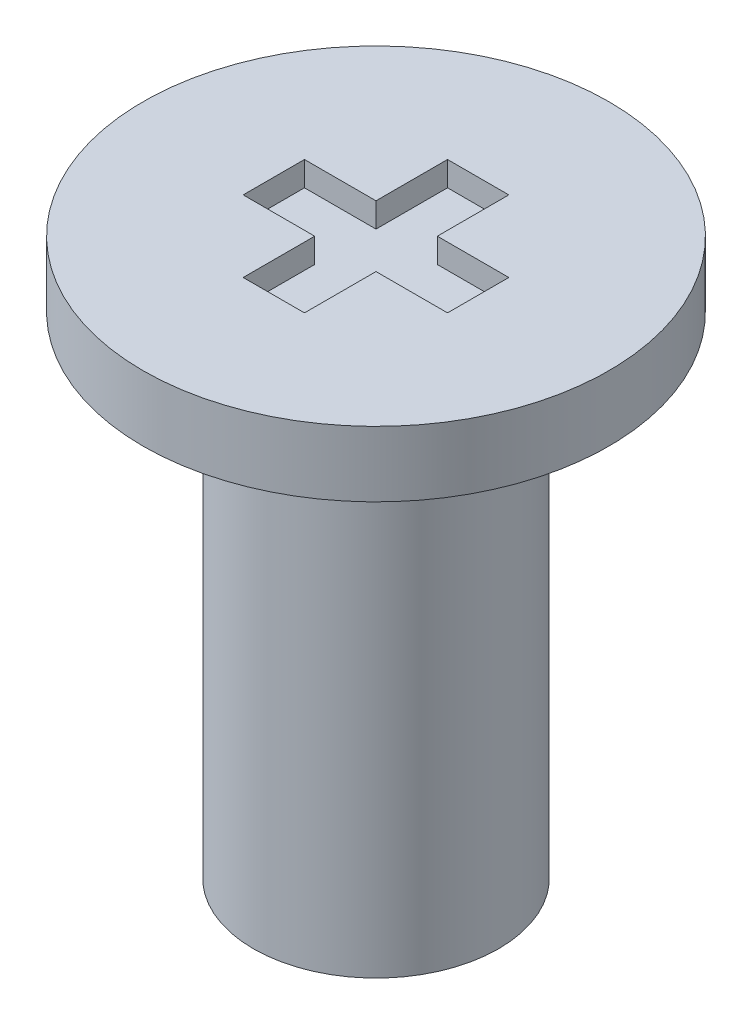
ISO-10303-21;
HEADER;
FILE_DESCRIPTION(('STEP AP214'),'2;1');
FILE_NAME('part.step','',(''),(''),'','','');
FILE_SCHEMA(('AUTOMOTIVE_DESIGN { 1 0 10303 214 1 1 1 1 }'));
ENDSEC;
DATA;
#1=APPLICATION_CONTEXT('core data for automotive mechanical design processes');
#2=APPLICATION_PROTOCOL_DEFINITION('international standard','automotive_design',2000,#1);
#3=PRODUCT_CONTEXT('',#1,'mechanical');
#4=PRODUCT('Part','Part','',(#3));
#5=PRODUCT_RELATED_PRODUCT_CATEGORY('part','',(#4));
#6=PRODUCT_DEFINITION_FORMATION('','',#4);
#7=PRODUCT_DEFINITION_CONTEXT('part definition',#1,'design');
#8=PRODUCT_DEFINITION('design','',#6,#7);
#9=PRODUCT_DEFINITION_SHAPE('','',#8);
#10=(LENGTH_UNIT() NAMED_UNIT(*) SI_UNIT(.MILLI.,.METRE.));
#11=(NAMED_UNIT(*) PLANE_ANGLE_UNIT() SI_UNIT($,.RADIAN.));
#12=(NAMED_UNIT(*) SI_UNIT($,.STERADIAN.) SOLID_ANGLE_UNIT());
#13=UNCERTAINTY_MEASURE_WITH_UNIT(LENGTH_MEASURE(1.E-05),#10,'distance_accuracy_value','');
#14=(GEOMETRIC_REPRESENTATION_CONTEXT(3) GLOBAL_UNCERTAINTY_ASSIGNED_CONTEXT((#13)) GLOBAL_UNIT_ASSIGNED_CONTEXT((#10,
#11,#12)) REPRESENTATION_CONTEXT('',''));
#15=CARTESIAN_POINT('',(0.,0.,0.));
#16=DIRECTION('',(0.,0.,1.));
#17=DIRECTION('',(1.,0.,0.));
#18=AXIS2_PLACEMENT_3D('',#15,#16,#17);
#19=CARTESIAN_POINT('',(0.,0.,0.));
#20=DIRECTION('',(0.,1.,0.));
#21=DIRECTION('',(0.,0.,1.));
#22=AXIS2_PLACEMENT_3D('',#19,#20,#21);
#23=PLANE('',#22);
#24=DIRECTION('',(-1.,0.,0.));
#25=VECTOR('',#24,1.);
#26=CARTESIAN_POINT('',(0.,0.,-0.375));
#27=LINE('',#26,#25);
#28=CARTESIAN_POINT('',(1.25,0.,-0.374999999999996));
#29=VERTEX_POINT('',#28);
#30=CARTESIAN_POINT('',(0.375,0.,-0.374999999999999));
#31=VERTEX_POINT('',#30);
#32=EDGE_CURVE('E222',#29,#31,#27,.T.);
#33=ORIENTED_EDGE('',*,*,#32,.F.);
#34=DIRECTION('',(0.,0.,-1.));
#35=VECTOR('',#34,1.);
#36=CARTESIAN_POINT('',(1.25,0.,-0.374999999999996));
#37=LINE('',#36,#35);
#38=CARTESIAN_POINT('',(1.25,0.,0.375000000000004));
#39=VERTEX_POINT('',#38);
#40=EDGE_CURVE('E149',#39,#29,#37,.T.);
#41=ORIENTED_EDGE('',*,*,#40,.F.);
#42=DIRECTION('',(1.,0.,0.));
#43=VECTOR('',#42,1.);
#44=CARTESIAN_POINT('',(0.,0.,0.375));
#45=LINE('',#44,#43);
#46=CARTESIAN_POINT('',(0.375,0.,0.375000000000004));
#47=VERTEX_POINT('',#46);
#48=EDGE_CURVE('E225',#47,#39,#45,.T.);
#49=ORIENTED_EDGE('',*,*,#48,.F.);
#50=DIRECTION('',(0.,0.,-1.));
#51=VECTOR('',#50,1.);
#52=CARTESIAN_POINT('',(0.375,0.,0.));
#53=LINE('',#52,#51);
#54=CARTESIAN_POINT('',(0.375,0.,1.25));
#55=VERTEX_POINT('',#54);
#56=EDGE_CURVE('E182',#55,#47,#53,.T.);
#57=ORIENTED_EDGE('',*,*,#56,.F.);
#58=DIRECTION('',(1.,0.,0.));
#59=VECTOR('',#58,1.);
#60=CARTESIAN_POINT('',(0.375,0.,1.25));
#61=LINE('',#60,#59);
#62=CARTESIAN_POINT('',(-0.375,0.,1.25));
#63=VERTEX_POINT('',#62);
#64=EDGE_CURVE('E187',#63,#55,#61,.T.);
#65=ORIENTED_EDGE('',*,*,#64,.F.);
#66=DIRECTION('',(0.,0.,1.));
#67=VECTOR('',#66,1.);
#68=CARTESIAN_POINT('',(-0.375,0.,0.));
#69=LINE('',#68,#67);
#70=CARTESIAN_POINT('',(-0.375,0.,0.374999999999996));
#71=VERTEX_POINT('',#70);
#72=EDGE_CURVE('E198',#71,#63,#69,.T.);
#73=ORIENTED_EDGE('',*,*,#72,.F.);
#74=DIRECTION('',(1.,0.,0.));
#75=VECTOR('',#74,1.);
#76=CARTESIAN_POINT('',(0.,0.,0.375));
#77=LINE('',#76,#75);
#78=CARTESIAN_POINT('',(-1.25,0.,0.374999999999987));
#79=VERTEX_POINT('',#78);
#80=EDGE_CURVE('E171',#79,#71,#77,.T.);
#81=ORIENTED_EDGE('',*,*,#80,.F.);
#82=DIRECTION('',(0.,0.,1.));
#83=VECTOR('',#82,1.);
#84=CARTESIAN_POINT('',(-1.25,0.,0.374999999999987));
#85=LINE('',#84,#83);
#86=CARTESIAN_POINT('',(-1.25,0.,-0.375000000000013));
#87=VERTEX_POINT('',#86);
#88=EDGE_CURVE('E168',#87,#79,#85,.T.);
#89=ORIENTED_EDGE('',*,*,#88,.F.);
#90=CARTESIAN_POINT('',(-0.375,0.,-0.375000000000001));
#91=VERTEX_POINT('',#90);
#92=EDGE_CURVE('E155',#91,#87,#27,.T.);
#93=ORIENTED_EDGE('',*,*,#92,.F.);
#94=DIRECTION('',(0.,0.,1.));
#95=VECTOR('',#94,1.);
#96=CARTESIAN_POINT('',(-0.375,0.,0.));
#97=LINE('',#96,#95);
#98=CARTESIAN_POINT('',(-0.375,0.,-1.25));
#99=VERTEX_POINT('',#98);
#100=EDGE_CURVE('E243',#99,#91,#97,.T.);
#101=ORIENTED_EDGE('',*,*,#100,.F.);
#102=DIRECTION('',(-1.,0.,0.));
#103=VECTOR('',#102,1.);
#104=CARTESIAN_POINT('',(-0.375,0.,-1.25));
#105=LINE('',#104,#103);
#106=CARTESIAN_POINT('',(0.375,0.,-1.25));
#107=VERTEX_POINT('',#106);
#108=EDGE_CURVE('E247',#107,#99,#105,.T.);
#109=ORIENTED_EDGE('',*,*,#108,.F.);
#110=DIRECTION('',(0.,0.,-1.));
#111=VECTOR('',#110,1.);
#112=CARTESIAN_POINT('',(0.375,0.,0.));
#113=LINE('',#112,#111);
#114=EDGE_CURVE('E74',#31,#107,#113,.T.);
#115=ORIENTED_EDGE('',*,*,#114,.F.);
#116=EDGE_LOOP('',(#33,#41,#49,#57,#65,#73,#81,#89,#93,#101,#109,#115));
#117=FACE_BOUND('',#116,.T.);
#118=CARTESIAN_POINT('',(0.,0.,0.));
#119=DIRECTION('',(0.,-1.,0.));
#120=DIRECTION('',(0.,0.,-1.));
#121=AXIS2_PLACEMENT_3D('',#118,#119,#120);
#122=CIRCLE('',#121,2.85);
#123=CARTESIAN_POINT('',(0.,0.,-2.85));
#124=VERTEX_POINT('',#123);
#125=EDGE_CURVE('E11',#124,#124,#122,.T.);
#126=ORIENTED_EDGE('',*,*,#125,.F.);
#127=EDGE_LOOP('',(#126));
#128=FACE_BOUND('',#127,.T.);
#129=ADVANCED_FACE('F45',(#117,#128),#23,.T.);
#130=CARTESIAN_POINT('',(0.,-6.8,0.));
#131=DIRECTION('',(0.,-1.,0.));
#132=DIRECTION('',(0.,0.,-1.));
#133=AXIS2_PLACEMENT_3D('',#130,#131,#132);
#134=CYLINDRICAL_SURFACE('',#133,2.85);
#135=ORIENTED_EDGE('',*,*,#125,.T.);
#136=EDGE_LOOP('',(#135));
#137=FACE_BOUND('',#136,.T.);
#138=CARTESIAN_POINT('',(0.,-0.8,0.));
#139=DIRECTION('',(0.,-1.,0.));
#140=DIRECTION('',(0.,0.,-1.));
#141=AXIS2_PLACEMENT_3D('',#138,#139,#140);
#142=CIRCLE('',#141,2.85);
#143=CARTESIAN_POINT('',(0.,-0.8,-2.85));
#144=VERTEX_POINT('',#143);
#145=EDGE_CURVE('E54',#144,#144,#142,.T.);
#146=ORIENTED_EDGE('',*,*,#145,.F.);
#147=EDGE_LOOP('',(#146));
#148=FACE_BOUND('',#147,.T.);
#149=ADVANCED_FACE('F279',(#137,#148),#134,.T.);
#150=CARTESIAN_POINT('',(2.85,-0.8,0.));
#151=DIRECTION('',(0.,-1.,0.));
#152=DIRECTION('',(0.,0.,-1.));
#153=AXIS2_PLACEMENT_3D('',#150,#151,#152);
#154=PLANE('',#153);
#155=ORIENTED_EDGE('',*,*,#145,.T.);
#156=EDGE_LOOP('',(#155));
#157=FACE_BOUND('',#156,.T.);
#158=CARTESIAN_POINT('',(0.,-0.8,0.));
#159=DIRECTION('',(0.,-1.,0.));
#160=DIRECTION('',(0.,0.,-1.));
#161=AXIS2_PLACEMENT_3D('',#158,#159,#160);
#162=CIRCLE('',#161,1.5);
#163=CARTESIAN_POINT('',(0.,-0.8,-1.5));
#164=VERTEX_POINT('',#163);
#165=EDGE_CURVE('E269',#164,#164,#162,.T.);
#166=ORIENTED_EDGE('',*,*,#165,.F.);
#167=EDGE_LOOP('',(#166));
#168=FACE_BOUND('',#167,.T.);
#169=ADVANCED_FACE('F276',(#157,#168),#154,.T.);
#170=CARTESIAN_POINT('',(0.,-6.8,0.));
#171=DIRECTION('',(0.,-1.,0.));
#172=DIRECTION('',(0.,0.,-1.));
#173=AXIS2_PLACEMENT_3D('',#170,#171,#172);
#174=CYLINDRICAL_SURFACE('',#173,1.5);
#175=ORIENTED_EDGE('',*,*,#165,.T.);
#176=EDGE_LOOP('',(#175));
#177=FACE_BOUND('',#176,.T.);
#178=CARTESIAN_POINT('',(0.,-6.8,0.));
#179=DIRECTION('',(0.,-1.,0.));
#180=DIRECTION('',(0.,0.,-1.));
#181=AXIS2_PLACEMENT_3D('',#178,#179,#180);
#182=CIRCLE('',#181,1.5);
#183=CARTESIAN_POINT('',(0.,-6.8,-1.5));
#184=VERTEX_POINT('',#183);
#185=EDGE_CURVE('E263',#184,#184,#182,.T.);
#186=ORIENTED_EDGE('',*,*,#185,.F.);
#187=EDGE_LOOP('',(#186));
#188=FACE_BOUND('',#187,.T.);
#189=ADVANCED_FACE('F286',(#177,#188),#174,.T.);
#190=CARTESIAN_POINT('',(1.5,-6.8,0.));
#191=DIRECTION('',(0.,-1.,0.));
#192=DIRECTION('',(0.,0.,-1.));
#193=AXIS2_PLACEMENT_3D('',#190,#191,#192);
#194=PLANE('',#193);
#195=ORIENTED_EDGE('',*,*,#185,.T.);
#196=EDGE_LOOP('',(#195));
#197=FACE_BOUND('',#196,.T.);
#198=ADVANCED_FACE('F292',(#197),#194,.T.);
#199=CARTESIAN_POINT('',(-0.375,-0.3,0.));
#200=DIRECTION('',(-1.,0.,0.));
#201=DIRECTION('',(0.,-1.,0.));
#202=AXIS2_PLACEMENT_3D('',#199,#200,#201);
#203=PLANE('',#202);
#204=ORIENTED_EDGE('',*,*,#100,.T.);
#205=DIRECTION('',(0.,-1.,0.));
#206=VECTOR('',#205,1.);
#207=CARTESIAN_POINT('',(-0.375,-0.3,-0.375000000000001));
#208=LINE('',#207,#206);
#209=CARTESIAN_POINT('',(-0.375,-0.3,-0.375000000000001));
#210=VERTEX_POINT('',#209);
#211=EDGE_CURVE('E240',#91,#210,#208,.T.);
#212=ORIENTED_EDGE('',*,*,#211,.T.);
#213=DIRECTION('',(0.,0.,1.));
#214=VECTOR('',#213,1.);
#215=CARTESIAN_POINT('',(-0.375,-0.3,0.));
#216=LINE('',#215,#214);
#217=CARTESIAN_POINT('',(-0.375,-0.3,-1.25));
#218=VERTEX_POINT('',#217);
#219=EDGE_CURVE('E146',#218,#210,#216,.T.);
#220=ORIENTED_EDGE('',*,*,#219,.F.);
#221=DIRECTION('',(0.,1.,0.));
#222=VECTOR('',#221,1.);
#223=CARTESIAN_POINT('',(-0.375,-0.3,-1.25));
#224=LINE('',#223,#222);
#225=EDGE_CURVE('E62',#218,#99,#224,.T.);
#226=ORIENTED_EDGE('',*,*,#225,.T.);
#227=EDGE_LOOP('',(#204,#212,#220,#226));
#228=FACE_BOUND('',#227,.T.);
#229=ADVANCED_FACE('F296',(#228),#203,.F.);
#230=CARTESIAN_POINT('',(-0.375,-0.3,-1.25));
#231=DIRECTION('',(0.,0.,-1.));
#232=DIRECTION('',(-1.,0.,0.));
#233=AXIS2_PLACEMENT_3D('',#230,#231,#232);
#234=PLANE('',#233);
#235=ORIENTED_EDGE('',*,*,#108,.T.);
#236=ORIENTED_EDGE('',*,*,#225,.F.);
#237=DIRECTION('',(-1.,0.,0.));
#238=VECTOR('',#237,1.);
#239=CARTESIAN_POINT('',(-0.375,-0.3,-1.25));
#240=LINE('',#239,#238);
#241=CARTESIAN_POINT('',(0.375,-0.3,-1.25));
#242=VERTEX_POINT('',#241);
#243=EDGE_CURVE('E250',#242,#218,#240,.T.);
#244=ORIENTED_EDGE('',*,*,#243,.F.);
#245=DIRECTION('',(0.,1.,0.));
#246=VECTOR('',#245,1.);
#247=CARTESIAN_POINT('',(0.375,-0.3,-1.25));
#248=LINE('',#247,#246);
#249=EDGE_CURVE('E253',#242,#107,#248,.T.);
#250=ORIENTED_EDGE('',*,*,#249,.T.);
#251=EDGE_LOOP('',(#235,#236,#244,#250));
#252=FACE_BOUND('',#251,.T.);
#253=ADVANCED_FACE('F300',(#252),#234,.F.);
#254=CARTESIAN_POINT('',(0.375,-0.3,0.));
#255=DIRECTION('',(1.,0.,0.));
#256=DIRECTION('',(0.,1.,0.));
#257=AXIS2_PLACEMENT_3D('',#254,#255,#256);
#258=PLANE('',#257);
#259=DIRECTION('',(0.,0.,-1.));
#260=VECTOR('',#259,1.);
#261=CARTESIAN_POINT('',(0.375,-0.3,0.));
#262=LINE('',#261,#260);
#263=CARTESIAN_POINT('',(0.375,-0.3,-0.374999999999999));
#264=VERTEX_POINT('',#263);
#265=EDGE_CURVE('E246',#264,#242,#262,.T.);
#266=ORIENTED_EDGE('',*,*,#265,.F.);
#267=DIRECTION('',(0.,1.,0.));
#268=VECTOR('',#267,1.);
#269=CARTESIAN_POINT('',(0.375,-0.3,-0.374999999999999));
#270=LINE('',#269,#268);
#271=EDGE_CURVE('E234',#264,#31,#270,.T.);
#272=ORIENTED_EDGE('',*,*,#271,.T.);
#273=ORIENTED_EDGE('',*,*,#114,.T.);
#274=ORIENTED_EDGE('',*,*,#249,.F.);
#275=EDGE_LOOP('',(#266,#272,#273,#274));
#276=FACE_BOUND('',#275,.T.);
#277=ADVANCED_FACE('F302',(#276),#258,.F.);
#278=CARTESIAN_POINT('',(0.,-0.3,0.));
#279=DIRECTION('',(0.,-1.,0.));
#280=DIRECTION('',(1.,0.,0.));
#281=AXIS2_PLACEMENT_3D('',#278,#279,#280);
#282=PLANE('',#281);
#283=DIRECTION('',(-1.,0.,0.));
#284=VECTOR('',#283,1.);
#285=CARTESIAN_POINT('',(0.,-0.3,-0.375));
#286=LINE('',#285,#284);
#287=CARTESIAN_POINT('',(1.25,-0.3,-0.374999999999996));
#288=VERTEX_POINT('',#287);
#289=EDGE_CURVE('E148',#288,#264,#286,.T.);
#290=ORIENTED_EDGE('',*,*,#289,.T.);
#291=ORIENTED_EDGE('',*,*,#265,.T.);
#292=ORIENTED_EDGE('',*,*,#243,.T.);
#293=ORIENTED_EDGE('',*,*,#219,.T.);
#294=CARTESIAN_POINT('',(-1.25,-0.3,-0.375000000000013));
#295=VERTEX_POINT('',#294);
#296=EDGE_CURVE('E82',#210,#295,#286,.T.);
#297=ORIENTED_EDGE('',*,*,#296,.T.);
#298=DIRECTION('',(0.,0.,1.));
#299=VECTOR('',#298,1.);
#300=CARTESIAN_POINT('',(-1.25,-0.3,0.374999999999987));
#301=LINE('',#300,#299);
#302=CARTESIAN_POINT('',(-1.25,-0.3,0.374999999999987));
#303=VERTEX_POINT('',#302);
#304=EDGE_CURVE('E144',#295,#303,#301,.T.);
#305=ORIENTED_EDGE('',*,*,#304,.T.);
#306=DIRECTION('',(1.,0.,0.));
#307=VECTOR('',#306,1.);
#308=CARTESIAN_POINT('',(0.,-0.3,0.375));
#309=LINE('',#308,#307);
#310=CARTESIAN_POINT('',(-0.375,-0.3,0.374999999999996));
#311=VERTEX_POINT('',#310);
#312=EDGE_CURVE('E165',#303,#311,#309,.T.);
#313=ORIENTED_EDGE('',*,*,#312,.T.);
#314=DIRECTION('',(0.,0.,1.));
#315=VECTOR('',#314,1.);
#316=CARTESIAN_POINT('',(-0.375,-0.3,0.));
#317=LINE('',#316,#315);
#318=CARTESIAN_POINT('',(-0.375,-0.3,1.25));
#319=VERTEX_POINT('',#318);
#320=EDGE_CURVE('E186',#311,#319,#317,.T.);
#321=ORIENTED_EDGE('',*,*,#320,.T.);
#322=DIRECTION('',(1.,0.,0.));
#323=VECTOR('',#322,1.);
#324=CARTESIAN_POINT('',(0.375,-0.3,1.25));
#325=LINE('',#324,#323);
#326=CARTESIAN_POINT('',(0.375,-0.3,1.25));
#327=VERTEX_POINT('',#326);
#328=EDGE_CURVE('E190',#319,#327,#325,.T.);
#329=ORIENTED_EDGE('',*,*,#328,.T.);
#330=DIRECTION('',(0.,0.,-1.));
#331=VECTOR('',#330,1.);
#332=CARTESIAN_POINT('',(0.375,-0.3,0.));
#333=LINE('',#332,#331);
#334=CARTESIAN_POINT('',(0.375,-0.3,0.375000000000004));
#335=VERTEX_POINT('',#334);
#336=EDGE_CURVE('E183',#327,#335,#333,.T.);
#337=ORIENTED_EDGE('',*,*,#336,.T.);
#338=DIRECTION('',(1.,0.,0.));
#339=VECTOR('',#338,1.);
#340=CARTESIAN_POINT('',(0.,-0.3,0.375));
#341=LINE('',#340,#339);
#342=CARTESIAN_POINT('',(1.25,-0.3,0.375000000000004));
#343=VERTEX_POINT('',#342);
#344=EDGE_CURVE('E214',#335,#343,#341,.T.);
#345=ORIENTED_EDGE('',*,*,#344,.T.);
#346=DIRECTION('',(0.,0.,-1.));
#347=VECTOR('',#346,1.);
#348=CARTESIAN_POINT('',(1.25,-0.3,-0.374999999999996));
#349=LINE('',#348,#347);
#350=EDGE_CURVE('E217',#343,#288,#349,.T.);
#351=ORIENTED_EDGE('',*,*,#350,.T.);
#352=EDGE_LOOP('',(#290,#291,#292,#293,#297,#305,#313,#321,#329,#337,#345,#351));
#353=FACE_BOUND('',#352,.T.);
#354=ADVANCED_FACE('F142',(#353),#282,.F.);
#355=CARTESIAN_POINT('',(0.,-0.3,-0.375));
#356=DIRECTION('',(0.,0.,-1.));
#357=DIRECTION('',(-1.,0.,0.));
#358=AXIS2_PLACEMENT_3D('',#355,#356,#357);
#359=PLANE('',#358);
#360=ORIENTED_EDGE('',*,*,#92,.T.);
#361=DIRECTION('',(0.,1.,0.));
#362=VECTOR('',#361,1.);
#363=CARTESIAN_POINT('',(-1.25,-0.3,-0.375000000000013));
#364=LINE('',#363,#362);
#365=EDGE_CURVE('E152',#295,#87,#364,.T.);
#366=ORIENTED_EDGE('',*,*,#365,.F.);
#367=ORIENTED_EDGE('',*,*,#296,.F.);
#368=ORIENTED_EDGE('',*,*,#211,.F.);
#369=EDGE_LOOP('',(#360,#366,#367,#368));
#370=FACE_BOUND('',#369,.T.);
#371=ADVANCED_FACE('F153',(#370),#359,.F.);
#372=ORIENTED_EDGE('',*,*,#289,.F.);
#373=DIRECTION('',(0.,1.,0.));
#374=VECTOR('',#373,1.);
#375=CARTESIAN_POINT('',(1.25,-0.3,-0.374999999999996));
#376=LINE('',#375,#374);
#377=EDGE_CURVE('E231',#288,#29,#376,.T.);
#378=ORIENTED_EDGE('',*,*,#377,.T.);
#379=ORIENTED_EDGE('',*,*,#32,.T.);
#380=ORIENTED_EDGE('',*,*,#271,.F.);
#381=EDGE_LOOP('',(#372,#378,#379,#380));
#382=FACE_BOUND('',#381,.T.);
#383=ADVANCED_FACE('F311',(#382),#359,.F.);
#384=CARTESIAN_POINT('',(1.25,-0.3,-0.374999999999996));
#385=DIRECTION('',(1.,0.,0.));
#386=DIRECTION('',(0.,0.,-1.));
#387=AXIS2_PLACEMENT_3D('',#384,#385,#386);
#388=PLANE('',#387);
#389=ORIENTED_EDGE('',*,*,#40,.T.);
#390=ORIENTED_EDGE('',*,*,#377,.F.);
#391=ORIENTED_EDGE('',*,*,#350,.F.);
#392=DIRECTION('',(0.,1.,0.));
#393=VECTOR('',#392,1.);
#394=CARTESIAN_POINT('',(1.25,-0.3,0.375000000000004));
#395=LINE('',#394,#393);
#396=EDGE_CURVE('E221',#343,#39,#395,.T.);
#397=ORIENTED_EDGE('',*,*,#396,.T.);
#398=EDGE_LOOP('',(#389,#390,#391,#397));
#399=FACE_BOUND('',#398,.T.);
#400=ADVANCED_FACE('F316',(#399),#388,.F.);
#401=CARTESIAN_POINT('',(0.,-0.3,0.375));
#402=DIRECTION('',(0.,0.,1.));
#403=DIRECTION('',(1.,0.,0.));
#404=AXIS2_PLACEMENT_3D('',#401,#402,#403);
#405=PLANE('',#404);
#406=DIRECTION('',(0.,1.,0.));
#407=VECTOR('',#406,1.);
#408=CARTESIAN_POINT('',(0.375,-0.3,0.375000000000001));
#409=LINE('',#408,#407);
#410=EDGE_CURVE('E207',#335,#47,#409,.T.);
#411=ORIENTED_EDGE('',*,*,#410,.T.);
#412=ORIENTED_EDGE('',*,*,#48,.T.);
#413=ORIENTED_EDGE('',*,*,#396,.F.);
#414=ORIENTED_EDGE('',*,*,#344,.F.);
#415=EDGE_LOOP('',(#411,#412,#413,#414));
#416=FACE_BOUND('',#415,.T.);
#417=ADVANCED_FACE('F312',(#416),#405,.F.);
#418=CARTESIAN_POINT('',(0.375,-0.3,0.));
#419=DIRECTION('',(1.,0.,0.));
#420=DIRECTION('',(0.,1.,0.));
#421=AXIS2_PLACEMENT_3D('',#418,#419,#420);
#422=PLANE('',#421);
#423=ORIENTED_EDGE('',*,*,#336,.F.);
#424=DIRECTION('',(0.,1.,0.));
#425=VECTOR('',#424,1.);
#426=CARTESIAN_POINT('',(0.375,-0.3,1.25));
#427=LINE('',#426,#425);
#428=EDGE_CURVE('E204',#327,#55,#427,.T.);
#429=ORIENTED_EDGE('',*,*,#428,.T.);
#430=ORIENTED_EDGE('',*,*,#56,.T.);
#431=ORIENTED_EDGE('',*,*,#410,.F.);
#432=EDGE_LOOP('',(#423,#429,#430,#431));
#433=FACE_BOUND('',#432,.T.);
#434=ADVANCED_FACE('F315',(#433),#422,.F.);
#435=CARTESIAN_POINT('',(0.375,-0.3,1.25));
#436=DIRECTION('',(0.,0.,1.));
#437=DIRECTION('',(1.,0.,0.));
#438=AXIS2_PLACEMENT_3D('',#435,#436,#437);
#439=PLANE('',#438);
#440=ORIENTED_EDGE('',*,*,#64,.T.);
#441=ORIENTED_EDGE('',*,*,#428,.F.);
#442=ORIENTED_EDGE('',*,*,#328,.F.);
#443=DIRECTION('',(0.,1.,0.));
#444=VECTOR('',#443,1.);
#445=CARTESIAN_POINT('',(-0.375,-0.3,1.25));
#446=LINE('',#445,#444);
#447=EDGE_CURVE('E194',#319,#63,#446,.T.);
#448=ORIENTED_EDGE('',*,*,#447,.T.);
#449=EDGE_LOOP('',(#440,#441,#442,#448));
#450=FACE_BOUND('',#449,.T.);
#451=ADVANCED_FACE('F323',(#450),#439,.F.);
#452=CARTESIAN_POINT('',(-0.375,-0.3,0.));
#453=DIRECTION('',(-1.,0.,0.));
#454=DIRECTION('',(0.,-1.,0.));
#455=AXIS2_PLACEMENT_3D('',#452,#453,#454);
#456=PLANE('',#455);
#457=DIRECTION('',(0.,1.,0.));
#458=VECTOR('',#457,1.);
#459=CARTESIAN_POINT('',(-0.375,-0.3,0.374999999999996));
#460=LINE('',#459,#458);
#461=EDGE_CURVE('E178',#311,#71,#460,.T.);
#462=ORIENTED_EDGE('',*,*,#461,.T.);
#463=ORIENTED_EDGE('',*,*,#72,.T.);
#464=ORIENTED_EDGE('',*,*,#447,.F.);
#465=ORIENTED_EDGE('',*,*,#320,.F.);
#466=EDGE_LOOP('',(#462,#463,#464,#465));
#467=FACE_BOUND('',#466,.T.);
#468=ADVANCED_FACE('F325',(#467),#456,.F.);
#469=CARTESIAN_POINT('',(0.,-0.3,0.375));
#470=DIRECTION('',(0.,0.,1.));
#471=DIRECTION('',(1.,0.,0.));
#472=AXIS2_PLACEMENT_3D('',#469,#470,#471);
#473=PLANE('',#472);
#474=ORIENTED_EDGE('',*,*,#312,.F.);
#475=DIRECTION('',(0.,1.,0.));
#476=VECTOR('',#475,1.);
#477=CARTESIAN_POINT('',(-1.25,-0.3,0.374999999999987));
#478=LINE('',#477,#476);
#479=EDGE_CURVE('E160',#303,#79,#478,.T.);
#480=ORIENTED_EDGE('',*,*,#479,.T.);
#481=ORIENTED_EDGE('',*,*,#80,.T.);
#482=ORIENTED_EDGE('',*,*,#461,.F.);
#483=EDGE_LOOP('',(#474,#480,#481,#482));
#484=FACE_BOUND('',#483,.T.);
#485=ADVANCED_FACE('F328',(#484),#473,.F.);
#486=CARTESIAN_POINT('',(-1.25,-0.3,0.374999999999987));
#487=DIRECTION('',(-1.,0.,0.));
#488=DIRECTION('',(0.,0.,1.));
#489=AXIS2_PLACEMENT_3D('',#486,#487,#488);
#490=PLANE('',#489);
#491=ORIENTED_EDGE('',*,*,#88,.T.);
#492=ORIENTED_EDGE('',*,*,#479,.F.);
#493=ORIENTED_EDGE('',*,*,#304,.F.);
#494=ORIENTED_EDGE('',*,*,#365,.T.);
#495=EDGE_LOOP('',(#491,#492,#493,#494));
#496=FACE_BOUND('',#495,.T.);
#497=ADVANCED_FACE('F162',(#496),#490,.F.);
#498=CLOSED_SHELL('',(#129,#149,#169,#189,#198,#229,#253,#277,#354,#371,#383,#400,#417,#434,
#451,#468,#485,#497));
#499=MANIFOLD_SOLID_BREP('B2',#498);
#500=ADVANCED_BREP_SHAPE_REPRESENTATION('',(#18,#499),#14);
#501=SHAPE_DEFINITION_REPRESENTATION(#9,#500);
ENDSEC;
END-ISO-10303-21;
